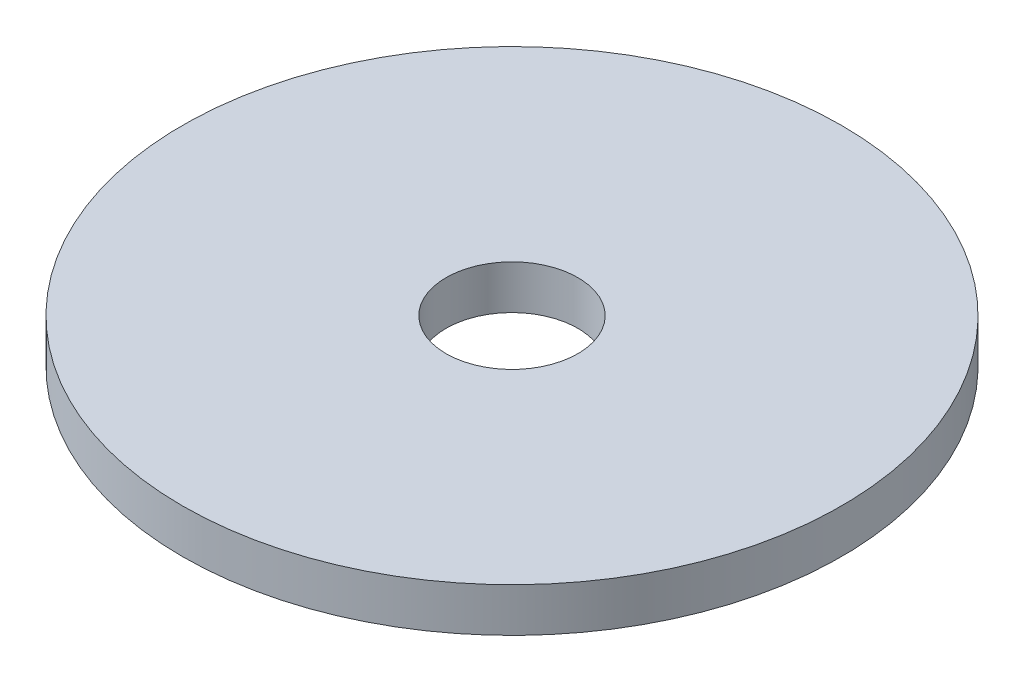
ISO-10303-21;
HEADER;
FILE_DESCRIPTION(('STEP AP214'),'2;1');
FILE_NAME('part.step','',(''),(''),'','','');
FILE_SCHEMA(('AUTOMOTIVE_DESIGN { 1 0 10303 214 1 1 1 1 }'));
ENDSEC;
DATA;
#1=APPLICATION_CONTEXT('core data for automotive mechanical design processes');
#2=APPLICATION_PROTOCOL_DEFINITION('international standard','automotive_design',2000,#1);
#3=PRODUCT_CONTEXT('',#1,'mechanical');
#4=PRODUCT('Part','Part','',(#3));
#5=PRODUCT_RELATED_PRODUCT_CATEGORY('part','',(#4));
#6=PRODUCT_DEFINITION_FORMATION('','',#4);
#7=PRODUCT_DEFINITION_CONTEXT('part definition',#1,'design');
#8=PRODUCT_DEFINITION('design','',#6,#7);
#9=PRODUCT_DEFINITION_SHAPE('','',#8);
#10=(LENGTH_UNIT() NAMED_UNIT(*) SI_UNIT(.MILLI.,.METRE.));
#11=(NAMED_UNIT(*) PLANE_ANGLE_UNIT() SI_UNIT($,.RADIAN.));
#12=(NAMED_UNIT(*) SI_UNIT($,.STERADIAN.) SOLID_ANGLE_UNIT());
#13=UNCERTAINTY_MEASURE_WITH_UNIT(LENGTH_MEASURE(1.E-05),#10,'distance_accuracy_value','');
#14=(GEOMETRIC_REPRESENTATION_CONTEXT(3) GLOBAL_UNCERTAINTY_ASSIGNED_CONTEXT((#13)) GLOBAL_UNIT_ASSIGNED_CONTEXT((#10,
#11,#12)) REPRESENTATION_CONTEXT('',''));
#15=CARTESIAN_POINT('',(0.,0.,0.));
#16=DIRECTION('',(0.,0.,1.));
#17=DIRECTION('',(1.,0.,0.));
#18=AXIS2_PLACEMENT_3D('',#15,#16,#17);
#19=CARTESIAN_POINT('',(0.,1.,0.));
#20=DIRECTION('',(0.,1.,0.));
#21=DIRECTION('',(0.,0.,1.));
#22=AXIS2_PLACEMENT_3D('',#19,#20,#21);
#23=PLANE('',#22);
#24=CARTESIAN_POINT('',(0.,1.,0.));
#25=DIRECTION('',(0.,1.,0.));
#26=DIRECTION('',(0.,0.,1.));
#27=AXIS2_PLACEMENT_3D('',#24,#25,#26);
#28=CIRCLE('',#27,7.5);
#29=CARTESIAN_POINT('',(0.,1.,7.5));
#30=VERTEX_POINT('',#29);
#31=EDGE_CURVE('E10',#30,#30,#28,.T.);
#32=ORIENTED_EDGE('',*,*,#31,.T.);
#33=EDGE_LOOP('',(#32));
#34=FACE_BOUND('',#33,.T.);
#35=CARTESIAN_POINT('',(0.,1.,0.));
#36=DIRECTION('',(0.,1.,0.));
#37=DIRECTION('',(0.,0.,1.));
#38=AXIS2_PLACEMENT_3D('',#35,#36,#37);
#39=CIRCLE('',#38,1.5);
#40=CARTESIAN_POINT('',(0.,1.,1.5));
#41=VERTEX_POINT('',#40);
#42=EDGE_CURVE('E55',#41,#41,#39,.T.);
#43=ORIENTED_EDGE('',*,*,#42,.F.);
#44=EDGE_LOOP('',(#43));
#45=FACE_BOUND('',#44,.T.);
#46=ADVANCED_FACE('F41',(#34,#45),#23,.T.);
#47=CARTESIAN_POINT('',(0.,0.,0.));
#48=DIRECTION('',(0.,1.,0.));
#49=DIRECTION('',(0.,0.,1.));
#50=AXIS2_PLACEMENT_3D('',#47,#48,#49);
#51=PLANE('',#50);
#52=CARTESIAN_POINT('',(0.,0.,0.));
#53=DIRECTION('',(0.,1.,0.));
#54=DIRECTION('',(0.,0.,1.));
#55=AXIS2_PLACEMENT_3D('',#52,#53,#54);
#56=CIRCLE('',#55,7.5);
#57=CARTESIAN_POINT('',(0.,0.,7.5));
#58=VERTEX_POINT('',#57);
#59=EDGE_CURVE('E45',#58,#58,#56,.T.);
#60=ORIENTED_EDGE('',*,*,#59,.F.);
#61=EDGE_LOOP('',(#60));
#62=FACE_BOUND('',#61,.T.);
#63=CARTESIAN_POINT('',(0.,0.,0.));
#64=DIRECTION('',(0.,1.,0.));
#65=DIRECTION('',(0.,0.,1.));
#66=AXIS2_PLACEMENT_3D('',#63,#64,#65);
#67=CIRCLE('',#66,1.5);
#68=CARTESIAN_POINT('',(0.,0.,1.5));
#69=VERTEX_POINT('',#68);
#70=EDGE_CURVE('E57',#69,#69,#67,.T.);
#71=ORIENTED_EDGE('',*,*,#70,.T.);
#72=EDGE_LOOP('',(#71));
#73=FACE_BOUND('',#72,.T.);
#74=ADVANCED_FACE('F68',(#62,#73),#51,.F.);
#75=CARTESIAN_POINT('',(0.,1.,0.));
#76=DIRECTION('',(0.,-1.,0.));
#77=DIRECTION('',(0.,0.,-1.));
#78=AXIS2_PLACEMENT_3D('',#75,#76,#77);
#79=CYLINDRICAL_SURFACE('',#78,7.5);
#80=ORIENTED_EDGE('',*,*,#31,.F.);
#81=EDGE_LOOP('',(#80));
#82=FACE_BOUND('',#81,.T.);
#83=ORIENTED_EDGE('',*,*,#59,.T.);
#84=EDGE_LOOP('',(#83));
#85=FACE_BOUND('',#84,.T.);
#86=ADVANCED_FACE('F43',(#82,#85),#79,.T.);
#87=CARTESIAN_POINT('',(0.,1.,0.));
#88=DIRECTION('',(0.,-1.,0.));
#89=DIRECTION('',(0.,0.,-1.));
#90=AXIS2_PLACEMENT_3D('',#87,#88,#89);
#91=CYLINDRICAL_SURFACE('',#90,1.5);
#92=ORIENTED_EDGE('',*,*,#42,.T.);
#93=EDGE_LOOP('',(#92));
#94=FACE_BOUND('',#93,.T.);
#95=ORIENTED_EDGE('',*,*,#70,.F.);
#96=EDGE_LOOP('',(#95));
#97=FACE_BOUND('',#96,.T.);
#98=ADVANCED_FACE('F64',(#94,#97),#91,.F.);
#99=CLOSED_SHELL('',(#46,#74,#86,#98));
#100=MANIFOLD_SOLID_BREP('B2',#99);
#101=ADVANCED_BREP_SHAPE_REPRESENTATION('',(#18,#100),#14);
#102=SHAPE_DEFINITION_REPRESENTATION(#9,#101);
ENDSEC;
END-ISO-10303-21;
